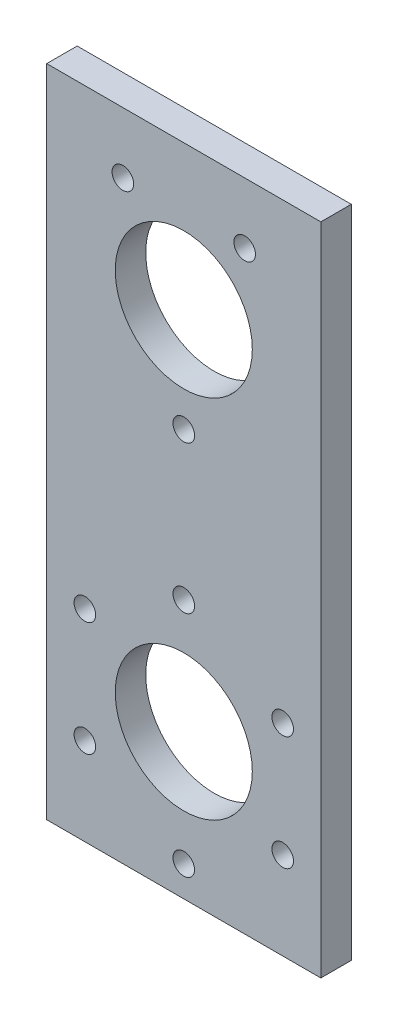
ISO-10303-21;
HEADER;
FILE_DESCRIPTION(('STEP AP214'),'2;1');
FILE_NAME('part.step','',(''),(''),'','','');
FILE_SCHEMA(('AUTOMOTIVE_DESIGN { 1 0 10303 214 1 1 1 1 }'));
ENDSEC;
DATA;
#1=APPLICATION_CONTEXT('core data for automotive mechanical design processes');
#2=APPLICATION_PROTOCOL_DEFINITION('international standard','automotive_design',2000,#1);
#3=PRODUCT_CONTEXT('',#1,'mechanical');
#4=PRODUCT('Part','Part','',(#3));
#5=PRODUCT_RELATED_PRODUCT_CATEGORY('part','',(#4));
#6=PRODUCT_DEFINITION_FORMATION('','',#4);
#7=PRODUCT_DEFINITION_CONTEXT('part definition',#1,'design');
#8=PRODUCT_DEFINITION('design','',#6,#7);
#9=PRODUCT_DEFINITION_SHAPE('','',#8);
#10=(LENGTH_UNIT() NAMED_UNIT(*) SI_UNIT(.MILLI.,.METRE.));
#11=(NAMED_UNIT(*) PLANE_ANGLE_UNIT() SI_UNIT($,.RADIAN.));
#12=(NAMED_UNIT(*) SI_UNIT($,.STERADIAN.) SOLID_ANGLE_UNIT());
#13=UNCERTAINTY_MEASURE_WITH_UNIT(LENGTH_MEASURE(1.E-05),#10,'distance_accuracy_value','');
#14=(GEOMETRIC_REPRESENTATION_CONTEXT(3) GLOBAL_UNCERTAINTY_ASSIGNED_CONTEXT((#13)) GLOBAL_UNIT_ASSIGNED_CONTEXT((#10,
#11,#12)) REPRESENTATION_CONTEXT('',''));
#15=CARTESIAN_POINT('',(0.,0.,0.));
#16=DIRECTION('',(0.,0.,1.));
#17=DIRECTION('',(1.,0.,0.));
#18=AXIS2_PLACEMENT_3D('',#15,#16,#17);
#19=CARTESIAN_POINT('',(0.,0.,3.175));
#20=DIRECTION('',(0.,0.,1.));
#21=DIRECTION('',(1.,0.,0.));
#22=AXIS2_PLACEMENT_3D('',#19,#20,#21);
#23=PLANE('',#22);
#24=CARTESIAN_POINT('',(-12.7,55.5625,3.175));
#25=DIRECTION('',(0.,0.,1.));
#26=DIRECTION('',(1.,0.,0.));
#27=AXIS2_PLACEMENT_3D('',#24,#25,#26);
#28=CIRCLE('',#27,2.2479);
#29=CARTESIAN_POINT('',(-10.4521,55.5625,3.175));
#30=VERTEX_POINT('',#29);
#31=EDGE_CURVE('E178',#30,#30,#28,.T.);
#32=ORIENTED_EDGE('',*,*,#31,.F.);
#33=EDGE_LOOP('',(#32));
#34=FACE_BOUND('',#33,.T.);
#35=CARTESIAN_POINT('',(12.7,55.5625,3.175));
#36=DIRECTION('',(0.,0.,1.));
#37=DIRECTION('',(1.,0.,0.));
#38=AXIS2_PLACEMENT_3D('',#35,#36,#37);
#39=CIRCLE('',#38,2.2479);
#40=CARTESIAN_POINT('',(14.9479,55.5625,3.175));
#41=VERTEX_POINT('',#40);
#42=EDGE_CURVE('E172',#41,#41,#39,.T.);
#43=ORIENTED_EDGE('',*,*,#42,.F.);
#44=EDGE_LOOP('',(#43));
#45=FACE_BOUND('',#44,.T.);
#46=CARTESIAN_POINT('',(0.,16.51,3.175));
#47=DIRECTION('',(0.,0.,1.));
#48=DIRECTION('',(1.,0.,0.));
#49=AXIS2_PLACEMENT_3D('',#46,#47,#48);
#50=CIRCLE('',#49,2.2479);
#51=CARTESIAN_POINT('',(2.2479,16.51,3.175));
#52=VERTEX_POINT('',#51);
#53=EDGE_CURVE('E166',#52,#52,#50,.T.);
#54=ORIENTED_EDGE('',*,*,#53,.F.);
#55=EDGE_LOOP('',(#54));
#56=FACE_BOUND('',#55,.T.);
#57=CARTESIAN_POINT('',(0.,-14.2875,3.175));
#58=DIRECTION('',(0.,0.,1.));
#59=DIRECTION('',(1.,0.,0.));
#60=AXIS2_PLACEMENT_3D('',#57,#58,#59);
#61=CIRCLE('',#60,2.2479);
#62=CARTESIAN_POINT('',(2.2479,-14.2875,3.175));
#63=VERTEX_POINT('',#62);
#64=EDGE_CURVE('E160',#63,#63,#61,.T.);
#65=ORIENTED_EDGE('',*,*,#64,.F.);
#66=EDGE_LOOP('',(#65));
#67=FACE_BOUND('',#66,.T.);
#68=CARTESIAN_POINT('',(20.6222299276171,-26.1937499999998,3.175));
#69=DIRECTION('',(0.,0.,1.));
#70=DIRECTION('',(1.,0.,0.));
#71=AXIS2_PLACEMENT_3D('',#68,#69,#70);
#72=CIRCLE('',#71,2.2479);
#73=CARTESIAN_POINT('',(22.8701299276171,-26.1937499999998,3.175));
#74=VERTEX_POINT('',#73);
#75=EDGE_CURVE('E154',#74,#74,#72,.T.);
#76=ORIENTED_EDGE('',*,*,#75,.F.);
#77=EDGE_LOOP('',(#76));
#78=FACE_BOUND('',#77,.T.);
#79=CARTESIAN_POINT('',(20.6222299276174,-50.0062499999998,3.175));
#80=DIRECTION('',(0.,0.,1.));
#81=DIRECTION('',(1.,0.,0.));
#82=AXIS2_PLACEMENT_3D('',#79,#80,#81);
#83=CIRCLE('',#82,2.2479);
#84=CARTESIAN_POINT('',(22.8701299276174,-50.0062499999998,3.175));
#85=VERTEX_POINT('',#84);
#86=EDGE_CURVE('E148',#85,#85,#83,.T.);
#87=ORIENTED_EDGE('',*,*,#86,.F.);
#88=EDGE_LOOP('',(#87));
#89=FACE_BOUND('',#88,.T.);
#90=CARTESIAN_POINT('',(5.01761586477682E-13,-61.9125,3.175));
#91=DIRECTION('',(0.,0.,1.));
#92=DIRECTION('',(1.,0.,0.));
#93=AXIS2_PLACEMENT_3D('',#90,#91,#92);
#94=CIRCLE('',#93,2.2479);
#95=CARTESIAN_POINT('',(2.2479000000005,-61.9125,3.175));
#96=VERTEX_POINT('',#95);
#97=EDGE_CURVE('E142',#96,#96,#94,.T.);
#98=ORIENTED_EDGE('',*,*,#97,.F.);
#99=EDGE_LOOP('',(#98));
#100=FACE_BOUND('',#99,.T.);
#101=CARTESIAN_POINT('',(-20.6222299276166,-50.0062500000001,3.175));
#102=DIRECTION('',(0.,0.,1.));
#103=DIRECTION('',(1.,0.,0.));
#104=AXIS2_PLACEMENT_3D('',#101,#102,#103);
#105=CIRCLE('',#104,2.2479);
#106=CARTESIAN_POINT('',(-18.3743299276166,-50.0062500000001,3.175));
#107=VERTEX_POINT('',#106);
#108=EDGE_CURVE('E136',#107,#107,#105,.T.);
#109=ORIENTED_EDGE('',*,*,#108,.F.);
#110=EDGE_LOOP('',(#109));
#111=FACE_BOUND('',#110,.T.);
#112=CARTESIAN_POINT('',(-20.6222299276166,-26.19375,3.175));
#113=DIRECTION('',(0.,0.,1.));
#114=DIRECTION('',(1.,0.,0.));
#115=AXIS2_PLACEMENT_3D('',#112,#113,#114);
#116=CIRCLE('',#115,2.2479);
#117=CARTESIAN_POINT('',(-18.3743299276166,-26.19375,3.175));
#118=VERTEX_POINT('',#117);
#119=EDGE_CURVE('E130',#118,#118,#116,.T.);
#120=ORIENTED_EDGE('',*,*,#119,.F.);
#121=EDGE_LOOP('',(#120));
#122=FACE_BOUND('',#121,.T.);
#123=CARTESIAN_POINT('',(0.,38.1,3.175));
#124=DIRECTION('',(0.,0.,1.));
#125=DIRECTION('',(1.,0.,0.));
#126=AXIS2_PLACEMENT_3D('',#123,#124,#125);
#127=CIRCLE('',#126,14.2875);
#128=CARTESIAN_POINT('',(14.2875,38.1,3.175));
#129=VERTEX_POINT('',#128);
#130=EDGE_CURVE('E104',#129,#129,#127,.T.);
#131=ORIENTED_EDGE('',*,*,#130,.F.);
#132=EDGE_LOOP('',(#131));
#133=FACE_BOUND('',#132,.T.);
#134=DIRECTION('',(0.,1.,0.));
#135=VECTOR('',#134,1.);
#136=CARTESIAN_POINT('',(28.575,68.2625,3.175));
#137=LINE('',#136,#135);
#138=CARTESIAN_POINT('',(28.575,-68.2625,3.175));
#139=VERTEX_POINT('',#138);
#140=CARTESIAN_POINT('',(28.575,68.2625,3.175));
#141=VERTEX_POINT('',#140);
#142=EDGE_CURVE('E89',#139,#141,#137,.T.);
#143=ORIENTED_EDGE('',*,*,#142,.T.);
#144=DIRECTION('',(-1.,0.,0.));
#145=VECTOR('',#144,1.);
#146=CARTESIAN_POINT('',(-28.575,68.2625,3.175));
#147=LINE('',#146,#145);
#148=CARTESIAN_POINT('',(-28.575,68.2625,3.175));
#149=VERTEX_POINT('',#148);
#150=EDGE_CURVE('E84',#141,#149,#147,.T.);
#151=ORIENTED_EDGE('',*,*,#150,.T.);
#152=DIRECTION('',(0.,-1.,0.));
#153=VECTOR('',#152,1.);
#154=CARTESIAN_POINT('',(-28.575,68.2625,3.175));
#155=LINE('',#154,#153);
#156=CARTESIAN_POINT('',(-28.575,-68.2625,3.175));
#157=VERTEX_POINT('',#156);
#158=EDGE_CURVE('E87',#149,#157,#155,.T.);
#159=ORIENTED_EDGE('',*,*,#158,.T.);
#160=DIRECTION('',(1.,0.,0.));
#161=VECTOR('',#160,1.);
#162=CARTESIAN_POINT('',(-28.575,-68.2625,3.175));
#163=LINE('',#162,#161);
#164=EDGE_CURVE('E54',#157,#139,#163,.T.);
#165=ORIENTED_EDGE('',*,*,#164,.T.);
#166=EDGE_LOOP('',(#143,#151,#159,#165));
#167=FACE_BOUND('',#166,.T.);
#168=CARTESIAN_POINT('',(0.,-38.1,3.175));
#169=DIRECTION('',(0.,0.,1.));
#170=DIRECTION('',(1.,0.,0.));
#171=AXIS2_PLACEMENT_3D('',#168,#169,#170);
#172=CIRCLE('',#171,14.2875);
#173=CARTESIAN_POINT('',(14.2875,-38.1,3.175));
#174=VERTEX_POINT('',#173);
#175=EDGE_CURVE('E119',#174,#174,#172,.T.);
#176=ORIENTED_EDGE('',*,*,#175,.F.);
#177=EDGE_LOOP('',(#176));
#178=FACE_BOUND('',#177,.T.);
#179=ADVANCED_FACE('F37',(#34,#45,#56,#67,#78,#89,#100,#111,#122,#133,#167,#178),#23,.T.);
#180=CARTESIAN_POINT('',(0.,0.,-3.175));
#181=DIRECTION('',(0.,0.,1.));
#182=DIRECTION('',(1.,0.,0.));
#183=AXIS2_PLACEMENT_3D('',#180,#181,#182);
#184=PLANE('',#183);
#185=CARTESIAN_POINT('',(-12.7,55.5625,-3.175));
#186=DIRECTION('',(0.,0.,1.));
#187=DIRECTION('',(1.,0.,0.));
#188=AXIS2_PLACEMENT_3D('',#185,#186,#187);
#189=CIRCLE('',#188,2.2479);
#190=CARTESIAN_POINT('',(-10.4521,55.5625,-3.175));
#191=VERTEX_POINT('',#190);
#192=EDGE_CURVE('E175',#191,#191,#189,.T.);
#193=ORIENTED_EDGE('',*,*,#192,.T.);
#194=EDGE_LOOP('',(#193));
#195=FACE_BOUND('',#194,.T.);
#196=CARTESIAN_POINT('',(12.7,55.5625,-3.175));
#197=DIRECTION('',(0.,0.,1.));
#198=DIRECTION('',(1.,0.,0.));
#199=AXIS2_PLACEMENT_3D('',#196,#197,#198);
#200=CIRCLE('',#199,2.2479);
#201=CARTESIAN_POINT('',(14.9479,55.5625,-3.175));
#202=VERTEX_POINT('',#201);
#203=EDGE_CURVE('E169',#202,#202,#200,.T.);
#204=ORIENTED_EDGE('',*,*,#203,.T.);
#205=EDGE_LOOP('',(#204));
#206=FACE_BOUND('',#205,.T.);
#207=CARTESIAN_POINT('',(0.,16.51,-3.175));
#208=DIRECTION('',(0.,0.,1.));
#209=DIRECTION('',(1.,0.,0.));
#210=AXIS2_PLACEMENT_3D('',#207,#208,#209);
#211=CIRCLE('',#210,2.2479);
#212=CARTESIAN_POINT('',(2.2479,16.51,-3.175));
#213=VERTEX_POINT('',#212);
#214=EDGE_CURVE('E163',#213,#213,#211,.T.);
#215=ORIENTED_EDGE('',*,*,#214,.T.);
#216=EDGE_LOOP('',(#215));
#217=FACE_BOUND('',#216,.T.);
#218=CARTESIAN_POINT('',(0.,-14.2875,-3.175));
#219=DIRECTION('',(0.,0.,1.));
#220=DIRECTION('',(1.,0.,0.));
#221=AXIS2_PLACEMENT_3D('',#218,#219,#220);
#222=CIRCLE('',#221,2.2479);
#223=CARTESIAN_POINT('',(2.2479,-14.2875,-3.175));
#224=VERTEX_POINT('',#223);
#225=EDGE_CURVE('E157',#224,#224,#222,.T.);
#226=ORIENTED_EDGE('',*,*,#225,.T.);
#227=EDGE_LOOP('',(#226));
#228=FACE_BOUND('',#227,.T.);
#229=CARTESIAN_POINT('',(20.6222299276171,-26.1937499999998,-3.175));
#230=DIRECTION('',(0.,0.,1.));
#231=DIRECTION('',(1.,0.,0.));
#232=AXIS2_PLACEMENT_3D('',#229,#230,#231);
#233=CIRCLE('',#232,2.2479);
#234=CARTESIAN_POINT('',(22.8701299276171,-26.1937499999998,-3.175));
#235=VERTEX_POINT('',#234);
#236=EDGE_CURVE('E151',#235,#235,#233,.T.);
#237=ORIENTED_EDGE('',*,*,#236,.T.);
#238=EDGE_LOOP('',(#237));
#239=FACE_BOUND('',#238,.T.);
#240=CARTESIAN_POINT('',(20.6222299276174,-50.0062499999998,-3.175));
#241=DIRECTION('',(0.,0.,1.));
#242=DIRECTION('',(1.,0.,0.));
#243=AXIS2_PLACEMENT_3D('',#240,#241,#242);
#244=CIRCLE('',#243,2.2479);
#245=CARTESIAN_POINT('',(22.8701299276174,-50.0062499999998,-3.175));
#246=VERTEX_POINT('',#245);
#247=EDGE_CURVE('E145',#246,#246,#244,.T.);
#248=ORIENTED_EDGE('',*,*,#247,.T.);
#249=EDGE_LOOP('',(#248));
#250=FACE_BOUND('',#249,.T.);
#251=CARTESIAN_POINT('',(5.01761586477682E-13,-61.9125,-3.175));
#252=DIRECTION('',(0.,0.,1.));
#253=DIRECTION('',(1.,0.,0.));
#254=AXIS2_PLACEMENT_3D('',#251,#252,#253);
#255=CIRCLE('',#254,2.2479);
#256=CARTESIAN_POINT('',(2.2479000000005,-61.9125,-3.175));
#257=VERTEX_POINT('',#256);
#258=EDGE_CURVE('E139',#257,#257,#255,.T.);
#259=ORIENTED_EDGE('',*,*,#258,.T.);
#260=EDGE_LOOP('',(#259));
#261=FACE_BOUND('',#260,.T.);
#262=CARTESIAN_POINT('',(-20.6222299276166,-50.0062500000001,-3.175));
#263=DIRECTION('',(0.,0.,1.));
#264=DIRECTION('',(1.,0.,0.));
#265=AXIS2_PLACEMENT_3D('',#262,#263,#264);
#266=CIRCLE('',#265,2.2479);
#267=CARTESIAN_POINT('',(-18.3743299276166,-50.0062500000001,-3.175));
#268=VERTEX_POINT('',#267);
#269=EDGE_CURVE('E133',#268,#268,#266,.T.);
#270=ORIENTED_EDGE('',*,*,#269,.T.);
#271=EDGE_LOOP('',(#270));
#272=FACE_BOUND('',#271,.T.);
#273=CARTESIAN_POINT('',(-20.6222299276166,-26.19375,-3.175));
#274=DIRECTION('',(0.,0.,1.));
#275=DIRECTION('',(1.,0.,0.));
#276=AXIS2_PLACEMENT_3D('',#273,#274,#275);
#277=CIRCLE('',#276,2.2479);
#278=CARTESIAN_POINT('',(-18.3743299276166,-26.19375,-3.175));
#279=VERTEX_POINT('',#278);
#280=EDGE_CURVE('E125',#279,#279,#277,.T.);
#281=ORIENTED_EDGE('',*,*,#280,.T.);
#282=EDGE_LOOP('',(#281));
#283=FACE_BOUND('',#282,.T.);
#284=CARTESIAN_POINT('',(0.,38.1,-3.175));
#285=DIRECTION('',(0.,0.,1.));
#286=DIRECTION('',(1.,0.,0.));
#287=AXIS2_PLACEMENT_3D('',#284,#285,#286);
#288=CIRCLE('',#287,14.2875);
#289=CARTESIAN_POINT('',(14.2875,38.1,-3.175));
#290=VERTEX_POINT('',#289);
#291=EDGE_CURVE('E116',#290,#290,#288,.T.);
#292=ORIENTED_EDGE('',*,*,#291,.T.);
#293=EDGE_LOOP('',(#292));
#294=FACE_BOUND('',#293,.T.);
#295=DIRECTION('',(0.,1.,0.));
#296=VECTOR('',#295,1.);
#297=CARTESIAN_POINT('',(28.575,68.2625,-3.175));
#298=LINE('',#297,#296);
#299=CARTESIAN_POINT('',(28.575,-68.2625,-3.175));
#300=VERTEX_POINT('',#299);
#301=CARTESIAN_POINT('',(28.575,68.2625,-3.175));
#302=VERTEX_POINT('',#301);
#303=EDGE_CURVE('E101',#300,#302,#298,.T.);
#304=ORIENTED_EDGE('',*,*,#303,.F.);
#305=DIRECTION('',(1.,0.,0.));
#306=VECTOR('',#305,1.);
#307=CARTESIAN_POINT('',(-28.575,-68.2625,-3.175));
#308=LINE('',#307,#306);
#309=CARTESIAN_POINT('',(-28.575,-68.2625,-3.175));
#310=VERTEX_POINT('',#309);
#311=EDGE_CURVE('E77',#310,#300,#308,.T.);
#312=ORIENTED_EDGE('',*,*,#311,.F.);
#313=DIRECTION('',(0.,-1.,0.));
#314=VECTOR('',#313,1.);
#315=CARTESIAN_POINT('',(-28.575,68.2625,-3.175));
#316=LINE('',#315,#314);
#317=CARTESIAN_POINT('',(-28.575,68.2625,-3.175));
#318=VERTEX_POINT('',#317);
#319=EDGE_CURVE('E71',#318,#310,#316,.T.);
#320=ORIENTED_EDGE('',*,*,#319,.F.);
#321=DIRECTION('',(-1.,0.,0.));
#322=VECTOR('',#321,1.);
#323=CARTESIAN_POINT('',(-28.575,68.2625,-3.175));
#324=LINE('',#323,#322);
#325=EDGE_CURVE('E93',#302,#318,#324,.T.);
#326=ORIENTED_EDGE('',*,*,#325,.F.);
#327=EDGE_LOOP('',(#304,#312,#320,#326));
#328=FACE_BOUND('',#327,.T.);
#329=CARTESIAN_POINT('',(0.,-38.1,-3.175));
#330=DIRECTION('',(0.,0.,1.));
#331=DIRECTION('',(1.,0.,0.));
#332=AXIS2_PLACEMENT_3D('',#329,#330,#331);
#333=CIRCLE('',#332,14.2875);
#334=CARTESIAN_POINT('',(14.2875,-38.1,-3.175));
#335=VERTEX_POINT('',#334);
#336=EDGE_CURVE('E122',#335,#335,#333,.T.);
#337=ORIENTED_EDGE('',*,*,#336,.T.);
#338=EDGE_LOOP('',(#337));
#339=FACE_BOUND('',#338,.T.);
#340=ADVANCED_FACE('F112',(#195,#206,#217,#228,#239,#250,#261,#272,#283,#294,#328,#339),#184,.F.);
#341=CARTESIAN_POINT('',(28.575,68.2625,3.175));
#342=DIRECTION('',(-1.,0.,0.));
#343=DIRECTION('',(0.,-1.,0.));
#344=AXIS2_PLACEMENT_3D('',#341,#342,#343);
#345=PLANE('',#344);
#346=ORIENTED_EDGE('',*,*,#303,.T.);
#347=DIRECTION('',(0.,0.,-1.));
#348=VECTOR('',#347,1.);
#349=CARTESIAN_POINT('',(28.575,68.2625,3.175));
#350=LINE('',#349,#348);
#351=EDGE_CURVE('E11',#141,#302,#350,.T.);
#352=ORIENTED_EDGE('',*,*,#351,.F.);
#353=ORIENTED_EDGE('',*,*,#142,.F.);
#354=DIRECTION('',(0.,0.,-1.));
#355=VECTOR('',#354,1.);
#356=CARTESIAN_POINT('',(28.575,-68.2625,3.175));
#357=LINE('',#356,#355);
#358=EDGE_CURVE('E97',#139,#300,#357,.T.);
#359=ORIENTED_EDGE('',*,*,#358,.T.);
#360=EDGE_LOOP('',(#346,#352,#353,#359));
#361=FACE_BOUND('',#360,.T.);
#362=ADVANCED_FACE('F39',(#361),#345,.F.);
#363=CARTESIAN_POINT('',(-28.575,68.2625,3.175));
#364=DIRECTION('',(0.,-1.,0.));
#365=DIRECTION('',(0.,0.,-1.));
#366=AXIS2_PLACEMENT_3D('',#363,#364,#365);
#367=PLANE('',#366);
#368=ORIENTED_EDGE('',*,*,#325,.T.);
#369=DIRECTION('',(0.,0.,-1.));
#370=VECTOR('',#369,1.);
#371=CARTESIAN_POINT('',(-28.575,68.2625,3.175));
#372=LINE('',#371,#370);
#373=EDGE_CURVE('E46',#149,#318,#372,.T.);
#374=ORIENTED_EDGE('',*,*,#373,.F.);
#375=ORIENTED_EDGE('',*,*,#150,.F.);
#376=ORIENTED_EDGE('',*,*,#351,.T.);
#377=EDGE_LOOP('',(#368,#374,#375,#376));
#378=FACE_BOUND('',#377,.T.);
#379=ADVANCED_FACE('F92',(#378),#367,.F.);
#380=CARTESIAN_POINT('',(-28.575,68.2625,3.175));
#381=DIRECTION('',(1.,0.,0.));
#382=DIRECTION('',(0.,1.,0.));
#383=AXIS2_PLACEMENT_3D('',#380,#381,#382);
#384=PLANE('',#383);
#385=ORIENTED_EDGE('',*,*,#319,.T.);
#386=DIRECTION('',(0.,0.,-1.));
#387=VECTOR('',#386,1.);
#388=CARTESIAN_POINT('',(-28.575,-68.2625,3.175));
#389=LINE('',#388,#387);
#390=EDGE_CURVE('E94',#157,#310,#389,.T.);
#391=ORIENTED_EDGE('',*,*,#390,.F.);
#392=ORIENTED_EDGE('',*,*,#158,.F.);
#393=ORIENTED_EDGE('',*,*,#373,.T.);
#394=EDGE_LOOP('',(#385,#391,#392,#393));
#395=FACE_BOUND('',#394,.T.);
#396=ADVANCED_FACE('F95',(#395),#384,.F.);
#397=CARTESIAN_POINT('',(-28.575,-68.2625,3.175));
#398=DIRECTION('',(0.,1.,0.));
#399=DIRECTION('',(0.,0.,1.));
#400=AXIS2_PLACEMENT_3D('',#397,#398,#399);
#401=PLANE('',#400);
#402=ORIENTED_EDGE('',*,*,#311,.T.);
#403=ORIENTED_EDGE('',*,*,#358,.F.);
#404=ORIENTED_EDGE('',*,*,#164,.F.);
#405=ORIENTED_EDGE('',*,*,#390,.T.);
#406=EDGE_LOOP('',(#402,#403,#404,#405));
#407=FACE_BOUND('',#406,.T.);
#408=ADVANCED_FACE('F109',(#407),#401,.F.);
#409=CARTESIAN_POINT('',(0.,38.1,3.175));
#410=DIRECTION('',(0.,0.,-1.));
#411=DIRECTION('',(-1.,0.,0.));
#412=AXIS2_PLACEMENT_3D('',#409,#410,#411);
#413=CYLINDRICAL_SURFACE('',#412,14.2875);
#414=ORIENTED_EDGE('',*,*,#130,.T.);
#415=EDGE_LOOP('',(#414));
#416=FACE_BOUND('',#415,.T.);
#417=ORIENTED_EDGE('',*,*,#291,.F.);
#418=EDGE_LOOP('',(#417));
#419=FACE_BOUND('',#418,.T.);
#420=ADVANCED_FACE('F205',(#416,#419),#413,.F.);
#421=CARTESIAN_POINT('',(0.,-38.1,3.175));
#422=DIRECTION('',(0.,0.,-1.));
#423=DIRECTION('',(-1.,0.,0.));
#424=AXIS2_PLACEMENT_3D('',#421,#422,#423);
#425=CYLINDRICAL_SURFACE('',#424,14.2875);
#426=ORIENTED_EDGE('',*,*,#175,.T.);
#427=EDGE_LOOP('',(#426));
#428=FACE_BOUND('',#427,.T.);
#429=ORIENTED_EDGE('',*,*,#336,.F.);
#430=EDGE_LOOP('',(#429));
#431=FACE_BOUND('',#430,.T.);
#432=ADVANCED_FACE('F208',(#428,#431),#425,.F.);
#433=CARTESIAN_POINT('',(-20.6222299276166,-26.19375,3.175));
#434=DIRECTION('',(0.,0.,1.));
#435=DIRECTION('',(1.,0.,0.));
#436=AXIS2_PLACEMENT_3D('',#433,#434,#435);
#437=CYLINDRICAL_SURFACE('',#436,2.2479);
#438=ORIENTED_EDGE('',*,*,#280,.F.);
#439=EDGE_LOOP('',(#438));
#440=FACE_BOUND('',#439,.T.);
#441=ORIENTED_EDGE('',*,*,#119,.T.);
#442=EDGE_LOOP('',(#441));
#443=FACE_BOUND('',#442,.T.);
#444=ADVANCED_FACE('F246',(#440,#443),#437,.F.);
#445=CARTESIAN_POINT('',(-20.6222299276166,-50.0062500000001,3.175));
#446=DIRECTION('',(0.,0.,1.));
#447=DIRECTION('',(1.,0.,0.));
#448=AXIS2_PLACEMENT_3D('',#445,#446,#447);
#449=CYLINDRICAL_SURFACE('',#448,2.2479);
#450=ORIENTED_EDGE('',*,*,#269,.F.);
#451=EDGE_LOOP('',(#450));
#452=FACE_BOUND('',#451,.T.);
#453=ORIENTED_EDGE('',*,*,#108,.T.);
#454=EDGE_LOOP('',(#453));
#455=FACE_BOUND('',#454,.T.);
#456=ADVANCED_FACE('F255',(#452,#455),#449,.F.);
#457=CARTESIAN_POINT('',(5.01761586477682E-13,-61.9125,3.175));
#458=DIRECTION('',(0.,0.,1.));
#459=DIRECTION('',(1.,0.,0.));
#460=AXIS2_PLACEMENT_3D('',#457,#458,#459);
#461=CYLINDRICAL_SURFACE('',#460,2.2479);
#462=ORIENTED_EDGE('',*,*,#258,.F.);
#463=EDGE_LOOP('',(#462));
#464=FACE_BOUND('',#463,.T.);
#465=ORIENTED_EDGE('',*,*,#97,.T.);
#466=EDGE_LOOP('',(#465));
#467=FACE_BOUND('',#466,.T.);
#468=ADVANCED_FACE('F263',(#464,#467),#461,.F.);
#469=CARTESIAN_POINT('',(20.6222299276174,-50.0062499999998,3.175));
#470=DIRECTION('',(0.,0.,1.));
#471=DIRECTION('',(1.,0.,0.));
#472=AXIS2_PLACEMENT_3D('',#469,#470,#471);
#473=CYLINDRICAL_SURFACE('',#472,2.2479);
#474=ORIENTED_EDGE('',*,*,#247,.F.);
#475=EDGE_LOOP('',(#474));
#476=FACE_BOUND('',#475,.T.);
#477=ORIENTED_EDGE('',*,*,#86,.T.);
#478=EDGE_LOOP('',(#477));
#479=FACE_BOUND('',#478,.T.);
#480=ADVANCED_FACE('F271',(#476,#479),#473,.F.);
#481=CARTESIAN_POINT('',(20.6222299276171,-26.1937499999998,3.175));
#482=DIRECTION('',(0.,0.,1.));
#483=DIRECTION('',(1.,0.,0.));
#484=AXIS2_PLACEMENT_3D('',#481,#482,#483);
#485=CYLINDRICAL_SURFACE('',#484,2.2479);
#486=ORIENTED_EDGE('',*,*,#236,.F.);
#487=EDGE_LOOP('',(#486));
#488=FACE_BOUND('',#487,.T.);
#489=ORIENTED_EDGE('',*,*,#75,.T.);
#490=EDGE_LOOP('',(#489));
#491=FACE_BOUND('',#490,.T.);
#492=ADVANCED_FACE('F279',(#488,#491),#485,.F.);
#493=CARTESIAN_POINT('',(0.,-14.2875,3.175));
#494=DIRECTION('',(0.,0.,1.));
#495=DIRECTION('',(1.,0.,0.));
#496=AXIS2_PLACEMENT_3D('',#493,#494,#495);
#497=CYLINDRICAL_SURFACE('',#496,2.2479);
#498=ORIENTED_EDGE('',*,*,#225,.F.);
#499=EDGE_LOOP('',(#498));
#500=FACE_BOUND('',#499,.T.);
#501=ORIENTED_EDGE('',*,*,#64,.T.);
#502=EDGE_LOOP('',(#501));
#503=FACE_BOUND('',#502,.T.);
#504=ADVANCED_FACE('F287',(#500,#503),#497,.F.);
#505=CARTESIAN_POINT('',(0.,16.51,3.175));
#506=DIRECTION('',(0.,0.,1.));
#507=DIRECTION('',(1.,0.,0.));
#508=AXIS2_PLACEMENT_3D('',#505,#506,#507);
#509=CYLINDRICAL_SURFACE('',#508,2.2479);
#510=ORIENTED_EDGE('',*,*,#214,.F.);
#511=EDGE_LOOP('',(#510));
#512=FACE_BOUND('',#511,.T.);
#513=ORIENTED_EDGE('',*,*,#53,.T.);
#514=EDGE_LOOP('',(#513));
#515=FACE_BOUND('',#514,.T.);
#516=ADVANCED_FACE('F294',(#512,#515),#509,.F.);
#517=CARTESIAN_POINT('',(12.7,55.5625,3.175));
#518=DIRECTION('',(0.,0.,1.));
#519=DIRECTION('',(1.,0.,0.));
#520=AXIS2_PLACEMENT_3D('',#517,#518,#519);
#521=CYLINDRICAL_SURFACE('',#520,2.2479);
#522=ORIENTED_EDGE('',*,*,#203,.F.);
#523=EDGE_LOOP('',(#522));
#524=FACE_BOUND('',#523,.T.);
#525=ORIENTED_EDGE('',*,*,#42,.T.);
#526=EDGE_LOOP('',(#525));
#527=FACE_BOUND('',#526,.T.);
#528=ADVANCED_FACE('F302',(#524,#527),#521,.F.);
#529=CARTESIAN_POINT('',(-12.7,55.5625,3.175));
#530=DIRECTION('',(0.,0.,1.));
#531=DIRECTION('',(1.,0.,0.));
#532=AXIS2_PLACEMENT_3D('',#529,#530,#531);
#533=CYLINDRICAL_SURFACE('',#532,2.2479);
#534=ORIENTED_EDGE('',*,*,#192,.F.);
#535=EDGE_LOOP('',(#534));
#536=FACE_BOUND('',#535,.T.);
#537=ORIENTED_EDGE('',*,*,#31,.T.);
#538=EDGE_LOOP('',(#537));
#539=FACE_BOUND('',#538,.T.);
#540=ADVANCED_FACE('F182',(#536,#539),#533,.F.);
#541=CLOSED_SHELL('',(#179,#340,#362,#379,#396,#408,#420,#432,#444,#456,#468,#480,#492,#504,
#516,#528,#540));
#542=MANIFOLD_SOLID_BREP('B2',#541);
#543=ADVANCED_BREP_SHAPE_REPRESENTATION('',(#18,#542),#14);
#544=SHAPE_DEFINITION_REPRESENTATION(#9,#543);
ENDSEC;
END-ISO-10303-21;
